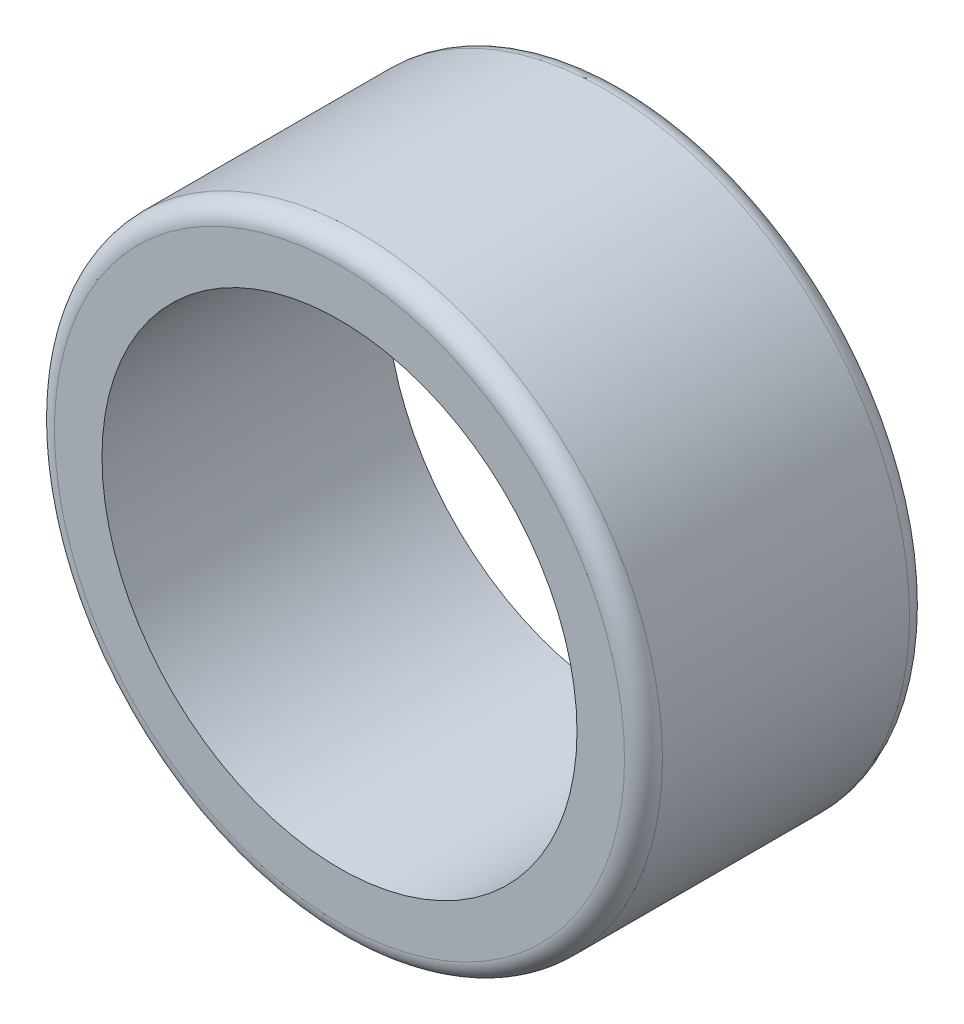
ISO-10303-21;
HEADER;
FILE_DESCRIPTION(('STEP AP214'),'2;1');
FILE_NAME('part.step','',(''),(''),'','','');
FILE_SCHEMA(('AUTOMOTIVE_DESIGN { 1 0 10303 214 1 1 1 1 }'));
ENDSEC;
DATA;
#1=APPLICATION_CONTEXT('core data for automotive mechanical design processes');
#2=APPLICATION_PROTOCOL_DEFINITION('international standard','automotive_design',2000,#1);
#3=PRODUCT_CONTEXT('',#1,'mechanical');
#4=PRODUCT('Part','Part','',(#3));
#5=PRODUCT_RELATED_PRODUCT_CATEGORY('part','',(#4));
#6=PRODUCT_DEFINITION_FORMATION('','',#4);
#7=PRODUCT_DEFINITION_CONTEXT('part definition',#1,'design');
#8=PRODUCT_DEFINITION('design','',#6,#7);
#9=PRODUCT_DEFINITION_SHAPE('','',#8);
#10=(LENGTH_UNIT() NAMED_UNIT(*) SI_UNIT(.MILLI.,.METRE.));
#11=(NAMED_UNIT(*) PLANE_ANGLE_UNIT() SI_UNIT($,.RADIAN.));
#12=(NAMED_UNIT(*) SI_UNIT($,.STERADIAN.) SOLID_ANGLE_UNIT());
#13=UNCERTAINTY_MEASURE_WITH_UNIT(LENGTH_MEASURE(1.E-05),#10,'distance_accuracy_value','');
#14=(GEOMETRIC_REPRESENTATION_CONTEXT(3) GLOBAL_UNCERTAINTY_ASSIGNED_CONTEXT((#13)) GLOBAL_UNIT_ASSIGNED_CONTEXT((#10,
#11,#12)) REPRESENTATION_CONTEXT('',''));
#15=CARTESIAN_POINT('',(0.,0.,0.));
#16=DIRECTION('',(0.,0.,1.));
#17=DIRECTION('',(1.,0.,0.));
#18=AXIS2_PLACEMENT_3D('',#15,#16,#17);
#19=CARTESIAN_POINT('',(0.,0.,30.));
#20=DIRECTION('',(0.,0.,1.));
#21=DIRECTION('',(1.,0.,0.));
#22=AXIS2_PLACEMENT_3D('',#19,#20,#21);
#23=PLANE('',#22);
#24=CARTESIAN_POINT('',(0.,0.,30.));
#25=DIRECTION('',(0.,0.,1.));
#26=DIRECTION('',(1.,0.,0.));
#27=AXIS2_PLACEMENT_3D('',#24,#25,#26);
#28=CIRCLE('',#27,30.);
#29=CARTESIAN_POINT('',(30.,0.,30.));
#30=VERTEX_POINT('',#29);
#31=EDGE_CURVE('E12',#30,#30,#28,.T.);
#32=ORIENTED_EDGE('',*,*,#31,.T.);
#33=EDGE_LOOP('',(#32));
#34=FACE_BOUND('',#33,.T.);
#35=CARTESIAN_POINT('',(0.,0.,30.));
#36=DIRECTION('',(0.,0.,1.));
#37=DIRECTION('',(1.,0.,0.));
#38=AXIS2_PLACEMENT_3D('',#35,#36,#37);
#39=CIRCLE('',#38,25.);
#40=CARTESIAN_POINT('',(25.,0.,30.));
#41=VERTEX_POINT('',#40);
#42=EDGE_CURVE('E62',#41,#41,#39,.T.);
#43=ORIENTED_EDGE('',*,*,#42,.F.);
#44=EDGE_LOOP('',(#43));
#45=FACE_BOUND('',#44,.T.);
#46=ADVANCED_FACE('F42',(#34,#45),#23,.T.);
#47=CARTESIAN_POINT('',(0.,0.,0.));
#48=DIRECTION('',(0.,0.,1.));
#49=DIRECTION('',(1.,0.,0.));
#50=AXIS2_PLACEMENT_3D('',#47,#48,#49);
#51=PLANE('',#50);
#52=CARTESIAN_POINT('',(0.,0.,0.));
#53=DIRECTION('',(0.,0.,1.));
#54=DIRECTION('',(1.,0.,0.));
#55=AXIS2_PLACEMENT_3D('',#52,#53,#54);
#56=CIRCLE('',#55,30.);
#57=CARTESIAN_POINT('',(30.,0.,0.));
#58=VERTEX_POINT('',#57);
#59=EDGE_CURVE('E49',#58,#58,#56,.F.);
#60=ORIENTED_EDGE('',*,*,#59,.T.);
#61=EDGE_LOOP('',(#60));
#62=FACE_BOUND('',#61,.T.);
#63=CARTESIAN_POINT('',(0.,0.,0.));
#64=DIRECTION('',(0.,0.,1.));
#65=DIRECTION('',(1.,0.,0.));
#66=AXIS2_PLACEMENT_3D('',#63,#64,#65);
#67=CIRCLE('',#66,25.);
#68=CARTESIAN_POINT('',(25.,0.,0.));
#69=VERTEX_POINT('',#68);
#70=EDGE_CURVE('E65',#69,#69,#67,.T.);
#71=ORIENTED_EDGE('',*,*,#70,.T.);
#72=EDGE_LOOP('',(#71));
#73=FACE_BOUND('',#72,.T.);
#74=ADVANCED_FACE('F69',(#62,#73),#51,.F.);
#75=CARTESIAN_POINT('',(0.,0.,30.));
#76=DIRECTION('',(0.,0.,-1.));
#77=DIRECTION('',(-1.,0.,0.));
#78=AXIS2_PLACEMENT_3D('',#75,#76,#77);
#79=CYLINDRICAL_SURFACE('',#78,32.);
#80=CARTESIAN_POINT('',(0.,0.,2.));
#81=DIRECTION('',(0.,0.,1.));
#82=DIRECTION('',(1.,0.,0.));
#83=AXIS2_PLACEMENT_3D('',#80,#81,#82);
#84=CIRCLE('',#83,32.);
#85=CARTESIAN_POINT('',(32.,0.,2.));
#86=VERTEX_POINT('',#85);
#87=EDGE_CURVE('E53',#86,#86,#84,.T.);
#88=ORIENTED_EDGE('',*,*,#87,.T.);
#89=EDGE_LOOP('',(#88));
#90=FACE_BOUND('',#89,.T.);
#91=CARTESIAN_POINT('',(0.,0.,28.));
#92=DIRECTION('',(0.,0.,1.));
#93=DIRECTION('',(1.,0.,0.));
#94=AXIS2_PLACEMENT_3D('',#91,#92,#93);
#95=CIRCLE('',#94,32.);
#96=CARTESIAN_POINT('',(32.,0.,28.));
#97=VERTEX_POINT('',#96);
#98=EDGE_CURVE('E57',#97,#97,#95,.F.);
#99=ORIENTED_EDGE('',*,*,#98,.T.);
#100=EDGE_LOOP('',(#99));
#101=FACE_BOUND('',#100,.T.);
#102=ADVANCED_FACE('F44',(#90,#101),#79,.T.);
#103=CARTESIAN_POINT('',(0.,0.,30.));
#104=DIRECTION('',(0.,0.,-1.));
#105=DIRECTION('',(-1.,0.,0.));
#106=AXIS2_PLACEMENT_3D('',#103,#104,#105);
#107=CYLINDRICAL_SURFACE('',#106,25.);
#108=ORIENTED_EDGE('',*,*,#42,.T.);
#109=EDGE_LOOP('',(#108));
#110=FACE_BOUND('',#109,.T.);
#111=ORIENTED_EDGE('',*,*,#70,.F.);
#112=EDGE_LOOP('',(#111));
#113=FACE_BOUND('',#112,.T.);
#114=ADVANCED_FACE('F71',(#110,#113),#107,.F.);
#115=CARTESIAN_POINT('',(0.,0.,2.));
#116=DIRECTION('',(0.,0.,1.));
#117=DIRECTION('',(1.,0.,0.));
#118=AXIS2_PLACEMENT_3D('',#115,#116,#117);
#119=TOROIDAL_SURFACE('',#118,30.,2.);
#120=ORIENTED_EDGE('',*,*,#59,.F.);
#121=EDGE_LOOP('',(#120));
#122=FACE_BOUND('',#121,.T.);
#123=ORIENTED_EDGE('',*,*,#87,.F.);
#124=EDGE_LOOP('',(#123));
#125=FACE_BOUND('',#124,.T.);
#126=ADVANCED_FACE('F73',(#122,#125),#119,.T.);
#127=CARTESIAN_POINT('',(0.,0.,28.));
#128=DIRECTION('',(0.,0.,1.));
#129=DIRECTION('',(1.,0.,0.));
#130=AXIS2_PLACEMENT_3D('',#127,#128,#129);
#131=TOROIDAL_SURFACE('',#130,30.,2.);
#132=ORIENTED_EDGE('',*,*,#98,.F.);
#133=EDGE_LOOP('',(#132));
#134=FACE_BOUND('',#133,.T.);
#135=ORIENTED_EDGE('',*,*,#31,.F.);
#136=EDGE_LOOP('',(#135));
#137=FACE_BOUND('',#136,.T.);
#138=ADVANCED_FACE('F80',(#134,#137),#131,.T.);
#139=CLOSED_SHELL('',(#46,#74,#102,#114,#126,#138));
#140=MANIFOLD_SOLID_BREP('B2',#139);
#141=ADVANCED_BREP_SHAPE_REPRESENTATION('',(#18,#140),#14);
#142=SHAPE_DEFINITION_REPRESENTATION(#9,#141);
ENDSEC;
END-ISO-10303-21;
